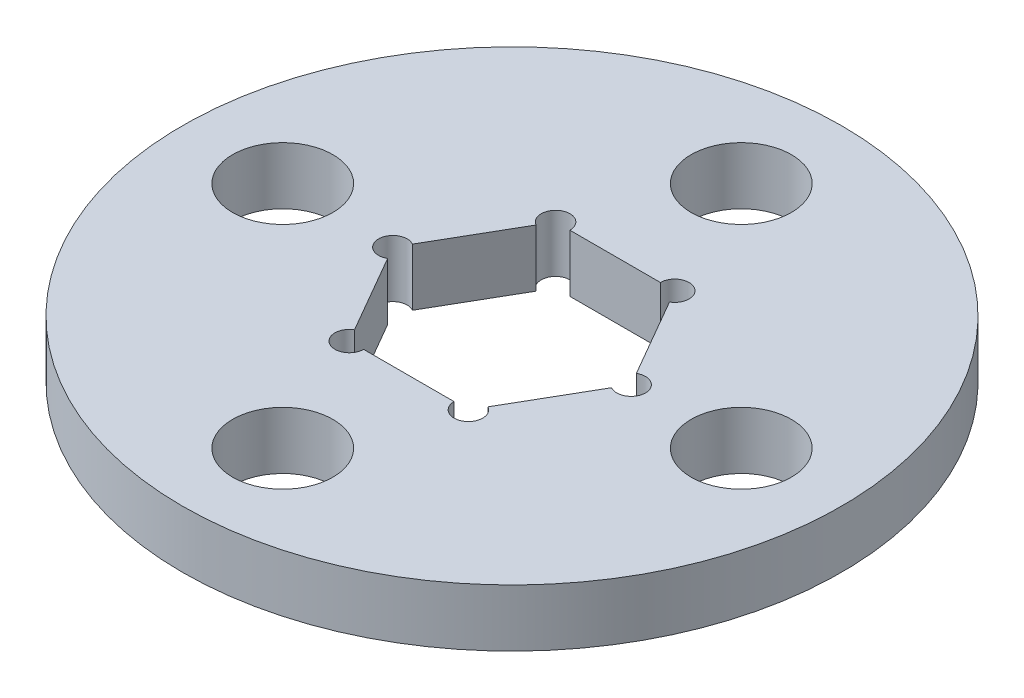
ISO-10303-21;
HEADER;
FILE_DESCRIPTION(('STEP AP214'),'2;1');
FILE_NAME('part.step','',(''),(''),'','','');
FILE_SCHEMA(('AUTOMOTIVE_DESIGN { 1 0 10303 214 1 1 1 1 }'));
ENDSEC;
DATA;
#1=APPLICATION_CONTEXT('core data for automotive mechanical design processes');
#2=APPLICATION_PROTOCOL_DEFINITION('international standard','automotive_design',2000,#1);
#3=PRODUCT_CONTEXT('',#1,'mechanical');
#4=PRODUCT('Part','Part','',(#3));
#5=PRODUCT_RELATED_PRODUCT_CATEGORY('part','',(#4));
#6=PRODUCT_DEFINITION_FORMATION('','',#4);
#7=PRODUCT_DEFINITION_CONTEXT('part definition',#1,'design');
#8=PRODUCT_DEFINITION('design','',#6,#7);
#9=PRODUCT_DEFINITION_SHAPE('','',#8);
#10=(LENGTH_UNIT() NAMED_UNIT(*) SI_UNIT(.MILLI.,.METRE.));
#11=(NAMED_UNIT(*) PLANE_ANGLE_UNIT() SI_UNIT($,.RADIAN.));
#12=(NAMED_UNIT(*) SI_UNIT($,.STERADIAN.) SOLID_ANGLE_UNIT());
#13=UNCERTAINTY_MEASURE_WITH_UNIT(LENGTH_MEASURE(1.E-05),#10,'distance_accuracy_value','');
#14=(GEOMETRIC_REPRESENTATION_CONTEXT(3) GLOBAL_UNCERTAINTY_ASSIGNED_CONTEXT((#13)) GLOBAL_UNIT_ASSIGNED_CONTEXT((#10,
#11,#12)) REPRESENTATION_CONTEXT('',''));
#15=CARTESIAN_POINT('',(0.,0.,0.));
#16=DIRECTION('',(0.,0.,1.));
#17=DIRECTION('',(1.,0.,0.));
#18=AXIS2_PLACEMENT_3D('',#15,#16,#17);
#19=CARTESIAN_POINT('',(0.,2.,0.));
#20=DIRECTION('',(0.,1.,0.));
#21=DIRECTION('',(0.,0.,1.));
#22=AXIS2_PLACEMENT_3D('',#19,#20,#21);
#23=PLANE('',#22);
#24=CARTESIAN_POINT('',(-4.15692193816526,2.,0.));
#25=DIRECTION('',(0.,-1.,0.));
#26=DIRECTION('',(0.,0.,-1.));
#27=AXIS2_PLACEMENT_3D('',#24,#25,#26);
#28=CIRCLE('',#27,0.5);
#29=CARTESIAN_POINT('',(-3.90692193816526,2.,0.433012701892296));
#30=VERTEX_POINT('',#29);
#31=CARTESIAN_POINT('',(-3.90692193816532,2.,-0.433012701892182));
#32=VERTEX_POINT('',#31);
#33=EDGE_CURVE('E345',#30,#32,#28,.T.);
#34=ORIENTED_EDGE('',*,*,#33,.T.);
#35=DIRECTION('',(-0.499999999999999,0.,0.866025403784439));
#36=VECTOR('',#35,1.);
#37=CARTESIAN_POINT('',(-2.07846096908265,2.,-3.6));
#38=LINE('',#37,#36);
#39=CARTESIAN_POINT('',(-2.32846096908267,2.,-3.16698729810775));
#40=VERTEX_POINT('',#39);
#41=EDGE_CURVE('E181',#40,#32,#38,.T.);
#42=ORIENTED_EDGE('',*,*,#41,.F.);
#43=CARTESIAN_POINT('',(-2.07846096908269,2.,-3.59999999999998));
#44=DIRECTION('',(0.,-1.,0.));
#45=DIRECTION('',(0.,0.,-1.));
#46=AXIS2_PLACEMENT_3D('',#43,#44,#45);
#47=CIRCLE('',#46,0.5);
#48=CARTESIAN_POINT('',(-1.57846096908269,2.,-3.6));
#49=VERTEX_POINT('',#48);
#50=EDGE_CURVE('E74',#40,#49,#47,.T.);
#51=ORIENTED_EDGE('',*,*,#50,.T.);
#52=DIRECTION('',(-1.,0.,0.));
#53=VECTOR('',#52,1.);
#54=CARTESIAN_POINT('',(2.07846096908265,2.,-3.6));
#55=LINE('',#54,#53);
#56=CARTESIAN_POINT('',(1.57846096908263,2.,-3.6));
#57=VERTEX_POINT('',#56);
#58=EDGE_CURVE('E300',#57,#49,#55,.T.);
#59=ORIENTED_EDGE('',*,*,#58,.F.);
#60=CARTESIAN_POINT('',(2.07846096908263,2.,-3.60000000000002));
#61=DIRECTION('',(0.,-1.,0.));
#62=DIRECTION('',(0.,0.,-1.));
#63=AXIS2_PLACEMENT_3D('',#60,#61,#62);
#64=CIRCLE('',#63,0.5);
#65=CARTESIAN_POINT('',(2.32846096908264,2.,-3.1669872981078));
#66=VERTEX_POINT('',#65);
#67=EDGE_CURVE('E66',#57,#66,#64,.T.);
#68=ORIENTED_EDGE('',*,*,#67,.T.);
#69=DIRECTION('',(-0.5,0.,-0.866025403784439));
#70=VECTOR('',#69,1.);
#71=CARTESIAN_POINT('',(4.15692193816531,2.,0.));
#72=LINE('',#71,#70);
#73=CARTESIAN_POINT('',(3.9069219381653,2.,-0.433012701892235));
#74=VERTEX_POINT('',#73);
#75=EDGE_CURVE('E209',#74,#66,#72,.T.);
#76=ORIENTED_EDGE('',*,*,#75,.F.);
#77=CARTESIAN_POINT('',(4.15692193816531,2.,0.));
#78=DIRECTION('',(0.,-1.,0.));
#79=DIRECTION('',(0.,0.,-1.));
#80=AXIS2_PLACEMENT_3D('',#77,#78,#79);
#81=CIRCLE('',#80,0.5);
#82=CARTESIAN_POINT('',(3.90692193816532,2.,0.433012701892201));
#83=VERTEX_POINT('',#82);
#84=EDGE_CURVE('E165',#74,#83,#81,.T.);
#85=ORIENTED_EDGE('',*,*,#84,.T.);
#86=DIRECTION('',(0.5,0.,-0.866025403784439));
#87=VECTOR('',#86,1.);
#88=CARTESIAN_POINT('',(2.07846096908265,2.,3.6));
#89=LINE('',#88,#87);
#90=CARTESIAN_POINT('',(2.32846096908266,2.,3.16698729810777));
#91=VERTEX_POINT('',#90);
#92=EDGE_CURVE('E162',#91,#83,#89,.T.);
#93=ORIENTED_EDGE('',*,*,#92,.F.);
#94=CARTESIAN_POINT('',(2.07846096908266,2.,3.59999999999999));
#95=DIRECTION('',(0.,-1.,0.));
#96=DIRECTION('',(0.,0.,-1.));
#97=AXIS2_PLACEMENT_3D('',#94,#95,#96);
#98=CIRCLE('',#97,0.5);
#99=CARTESIAN_POINT('',(1.57846096908266,2.,3.6));
#100=VERTEX_POINT('',#99);
#101=EDGE_CURVE('E142',#91,#100,#98,.T.);
#102=ORIENTED_EDGE('',*,*,#101,.T.);
#103=DIRECTION('',(1.,0.,0.));
#104=VECTOR('',#103,1.);
#105=CARTESIAN_POINT('',(-2.07846096908265,2.,3.6));
#106=LINE('',#105,#104);
#107=CARTESIAN_POINT('',(-1.57846096908265,2.,3.6));
#108=VERTEX_POINT('',#107);
#109=EDGE_CURVE('E159',#108,#100,#106,.T.);
#110=ORIENTED_EDGE('',*,*,#109,.F.);
#111=CARTESIAN_POINT('',(-2.07846096908265,2.,3.6));
#112=DIRECTION('',(0.,-1.,0.));
#113=DIRECTION('',(0.,0.,-1.));
#114=AXIS2_PLACEMENT_3D('',#111,#112,#113);
#115=CIRCLE('',#114,0.5);
#116=CARTESIAN_POINT('',(-2.32846096908265,2.,3.16698729810778));
#117=VERTEX_POINT('',#116);
#118=EDGE_CURVE('E164',#108,#117,#115,.T.);
#119=ORIENTED_EDGE('',*,*,#118,.T.);
#120=DIRECTION('',(0.5,0.,0.866025403784439));
#121=VECTOR('',#120,1.);
#122=CARTESIAN_POINT('',(-4.1569219381653,2.,0.));
#123=LINE('',#122,#121);
#124=EDGE_CURVE('E171',#30,#117,#123,.T.);
#125=ORIENTED_EDGE('',*,*,#124,.F.);
#126=EDGE_LOOP('',(#34,#42,#51,#59,#68,#76,#85,#93,#102,#110,#119,#125));
#127=FACE_BOUND('',#126,.T.);
#128=CARTESIAN_POINT('',(0.,2.,8.));
#129=DIRECTION('',(0.,1.,0.));
#130=DIRECTION('',(0.,0.,1.));
#131=AXIS2_PLACEMENT_3D('',#128,#129,#130);
#132=CIRCLE('',#131,1.75);
#133=CARTESIAN_POINT('',(0.,2.,9.75));
#134=VERTEX_POINT('',#133);
#135=EDGE_CURVE('E276',#134,#134,#132,.T.);
#136=ORIENTED_EDGE('',*,*,#135,.F.);
#137=EDGE_LOOP('',(#136));
#138=FACE_BOUND('',#137,.T.);
#139=CARTESIAN_POINT('',(0.,2.,-8.));
#140=DIRECTION('',(0.,1.,0.));
#141=DIRECTION('',(0.,0.,1.));
#142=AXIS2_PLACEMENT_3D('',#139,#140,#141);
#143=CIRCLE('',#142,1.75);
#144=CARTESIAN_POINT('',(0.,2.,-6.25));
#145=VERTEX_POINT('',#144);
#146=EDGE_CURVE('E190',#145,#145,#143,.T.);
#147=ORIENTED_EDGE('',*,*,#146,.F.);
#148=EDGE_LOOP('',(#147));
#149=FACE_BOUND('',#148,.T.);
#150=CARTESIAN_POINT('',(0.,2.,0.));
#151=DIRECTION('',(0.,1.,0.));
#152=DIRECTION('',(0.,0.,1.));
#153=AXIS2_PLACEMENT_3D('',#150,#151,#152);
#154=CIRCLE('',#153,11.5);
#155=CARTESIAN_POINT('',(0.,2.,11.5));
#156=VERTEX_POINT('',#155);
#157=EDGE_CURVE('E210',#156,#156,#154,.T.);
#158=ORIENTED_EDGE('',*,*,#157,.T.);
#159=EDGE_LOOP('',(#158));
#160=FACE_BOUND('',#159,.T.);
#161=CARTESIAN_POINT('',(8.,2.,0.));
#162=DIRECTION('',(0.,1.,0.));
#163=DIRECTION('',(0.,0.,1.));
#164=AXIS2_PLACEMENT_3D('',#161,#162,#163);
#165=CIRCLE('',#164,1.75);
#166=CARTESIAN_POINT('',(8.,2.,1.75));
#167=VERTEX_POINT('',#166);
#168=EDGE_CURVE('E283',#167,#167,#165,.T.);
#169=ORIENTED_EDGE('',*,*,#168,.F.);
#170=EDGE_LOOP('',(#169));
#171=FACE_BOUND('',#170,.T.);
#172=CARTESIAN_POINT('',(-8.,2.,0.));
#173=DIRECTION('',(0.,1.,0.));
#174=DIRECTION('',(0.,0.,1.));
#175=AXIS2_PLACEMENT_3D('',#172,#173,#174);
#176=CIRCLE('',#175,1.75);
#177=CARTESIAN_POINT('',(-8.,2.,1.75));
#178=VERTEX_POINT('',#177);
#179=EDGE_CURVE('E268',#178,#178,#176,.T.);
#180=ORIENTED_EDGE('',*,*,#179,.F.);
#181=EDGE_LOOP('',(#180));
#182=FACE_BOUND('',#181,.T.);
#183=ADVANCED_FACE('F51',(#127,#138,#149,#160,#171,#182),#23,.T.);
#184=CARTESIAN_POINT('',(0.,0.,0.));
#185=DIRECTION('',(0.,1.,0.));
#186=DIRECTION('',(0.,0.,1.));
#187=AXIS2_PLACEMENT_3D('',#184,#185,#186);
#188=PLANE('',#187);
#189=CARTESIAN_POINT('',(0.,0.,0.));
#190=DIRECTION('',(0.,1.,0.));
#191=DIRECTION('',(0.,0.,1.));
#192=AXIS2_PLACEMENT_3D('',#189,#190,#191);
#193=CIRCLE('',#192,11.5);
#194=CARTESIAN_POINT('',(0.,0.,11.5));
#195=VERTEX_POINT('',#194);
#196=EDGE_CURVE('E177',#195,#195,#193,.T.);
#197=ORIENTED_EDGE('',*,*,#196,.F.);
#198=EDGE_LOOP('',(#197));
#199=FACE_BOUND('',#198,.T.);
#200=DIRECTION('',(-0.499999999999999,0.,0.866025403784439));
#201=VECTOR('',#200,1.);
#202=CARTESIAN_POINT('',(-2.07846096908265,0.,-3.6));
#203=LINE('',#202,#201);
#204=CARTESIAN_POINT('',(-2.32846096908267,0.,-3.16698729810775));
#205=VERTEX_POINT('',#204);
#206=CARTESIAN_POINT('',(-3.90692193816532,0.,-0.433012701892182));
#207=VERTEX_POINT('',#206);
#208=EDGE_CURVE('E194',#205,#207,#203,.T.);
#209=ORIENTED_EDGE('',*,*,#208,.T.);
#210=CARTESIAN_POINT('',(-4.15692193816526,0.,0.));
#211=DIRECTION('',(0.,1.,0.));
#212=DIRECTION('',(0.,0.,1.));
#213=AXIS2_PLACEMENT_3D('',#210,#211,#212);
#214=CIRCLE('',#213,0.5);
#215=CARTESIAN_POINT('',(-3.90692193816526,0.,0.433012701892295));
#216=VERTEX_POINT('',#215);
#217=EDGE_CURVE('E251',#207,#216,#214,.T.);
#218=ORIENTED_EDGE('',*,*,#217,.T.);
#219=DIRECTION('',(0.5,0.,0.866025403784439));
#220=VECTOR('',#219,1.);
#221=CARTESIAN_POINT('',(-4.1569219381653,0.,0.));
#222=LINE('',#221,#220);
#223=CARTESIAN_POINT('',(-2.32846096908265,0.,3.16698729810778));
#224=VERTEX_POINT('',#223);
#225=EDGE_CURVE('E198',#216,#224,#222,.T.);
#226=ORIENTED_EDGE('',*,*,#225,.T.);
#227=CARTESIAN_POINT('',(-2.07846096908265,0.,3.6));
#228=DIRECTION('',(0.,1.,0.));
#229=DIRECTION('',(0.,0.,1.));
#230=AXIS2_PLACEMENT_3D('',#227,#228,#229);
#231=CIRCLE('',#230,0.5);
#232=CARTESIAN_POINT('',(-1.57846096908265,0.,3.6));
#233=VERTEX_POINT('',#232);
#234=EDGE_CURVE('E315',#224,#233,#231,.T.);
#235=ORIENTED_EDGE('',*,*,#234,.T.);
#236=DIRECTION('',(1.,0.,0.));
#237=VECTOR('',#236,1.);
#238=CARTESIAN_POINT('',(-2.07846096908265,0.,3.6));
#239=LINE('',#238,#237);
#240=CARTESIAN_POINT('',(1.57846096908266,0.,3.6));
#241=VERTEX_POINT('',#240);
#242=EDGE_CURVE('E202',#233,#241,#239,.T.);
#243=ORIENTED_EDGE('',*,*,#242,.T.);
#244=CARTESIAN_POINT('',(2.07846096908266,0.,3.59999999999999));
#245=DIRECTION('',(0.,1.,0.));
#246=DIRECTION('',(0.,0.,1.));
#247=AXIS2_PLACEMENT_3D('',#244,#245,#246);
#248=CIRCLE('',#247,0.5);
#249=CARTESIAN_POINT('',(2.32846096908266,0.,3.16698729810777));
#250=VERTEX_POINT('',#249);
#251=EDGE_CURVE('E145',#241,#250,#248,.T.);
#252=ORIENTED_EDGE('',*,*,#251,.T.);
#253=DIRECTION('',(0.5,0.,-0.866025403784439));
#254=VECTOR('',#253,1.);
#255=CARTESIAN_POINT('',(2.07846096908265,0.,3.6));
#256=LINE('',#255,#254);
#257=CARTESIAN_POINT('',(3.90692193816532,0.,0.433012701892201));
#258=VERTEX_POINT('',#257);
#259=EDGE_CURVE('E205',#250,#258,#256,.T.);
#260=ORIENTED_EDGE('',*,*,#259,.T.);
#261=CARTESIAN_POINT('',(4.15692193816531,0.,0.));
#262=DIRECTION('',(0.,1.,0.));
#263=DIRECTION('',(0.,0.,1.));
#264=AXIS2_PLACEMENT_3D('',#261,#262,#263);
#265=CIRCLE('',#264,0.5);
#266=CARTESIAN_POINT('',(3.9069219381653,0.,-0.433012701892235));
#267=VERTEX_POINT('',#266);
#268=EDGE_CURVE('E151',#258,#267,#265,.T.);
#269=ORIENTED_EDGE('',*,*,#268,.T.);
#270=DIRECTION('',(-0.5,0.,-0.866025403784439));
#271=VECTOR('',#270,1.);
#272=CARTESIAN_POINT('',(4.15692193816531,0.,0.));
#273=LINE('',#272,#271);
#274=CARTESIAN_POINT('',(2.32846096908264,0.,-3.1669872981078));
#275=VERTEX_POINT('',#274);
#276=EDGE_CURVE('E185',#267,#275,#273,.T.);
#277=ORIENTED_EDGE('',*,*,#276,.T.);
#278=CARTESIAN_POINT('',(2.07846096908263,0.,-3.60000000000002));
#279=DIRECTION('',(0.,1.,0.));
#280=DIRECTION('',(0.,0.,1.));
#281=AXIS2_PLACEMENT_3D('',#278,#279,#280);
#282=CIRCLE('',#281,0.5);
#283=CARTESIAN_POINT('',(1.57846096908263,0.,-3.6));
#284=VERTEX_POINT('',#283);
#285=EDGE_CURVE('E261',#275,#284,#282,.T.);
#286=ORIENTED_EDGE('',*,*,#285,.T.);
#287=DIRECTION('',(-1.,0.,0.));
#288=VECTOR('',#287,1.);
#289=CARTESIAN_POINT('',(2.07846096908265,0.,-3.6));
#290=LINE('',#289,#288);
#291=CARTESIAN_POINT('',(-1.57846096908269,0.,-3.6));
#292=VERTEX_POINT('',#291);
#293=EDGE_CURVE('E189',#284,#292,#290,.T.);
#294=ORIENTED_EDGE('',*,*,#293,.T.);
#295=CARTESIAN_POINT('',(-2.07846096908269,0.,-3.59999999999998));
#296=DIRECTION('',(0.,1.,0.));
#297=DIRECTION('',(0.,0.,1.));
#298=AXIS2_PLACEMENT_3D('',#295,#296,#297);
#299=CIRCLE('',#298,0.5);
#300=EDGE_CURVE('E231',#292,#205,#299,.T.);
#301=ORIENTED_EDGE('',*,*,#300,.T.);
#302=EDGE_LOOP('',(#209,#218,#226,#235,#243,#252,#260,#269,#277,#286,#294,#301));
#303=FACE_BOUND('',#302,.T.);
#304=CARTESIAN_POINT('',(0.,0.,-8.));
#305=DIRECTION('',(0.,1.,0.));
#306=DIRECTION('',(0.,0.,1.));
#307=AXIS2_PLACEMENT_3D('',#304,#305,#306);
#308=CIRCLE('',#307,1.75);
#309=CARTESIAN_POINT('',(0.,0.,-6.25));
#310=VERTEX_POINT('',#309);
#311=EDGE_CURVE('E287',#310,#310,#308,.T.);
#312=ORIENTED_EDGE('',*,*,#311,.T.);
#313=EDGE_LOOP('',(#312));
#314=FACE_BOUND('',#313,.T.);
#315=CARTESIAN_POINT('',(8.,0.,0.));
#316=DIRECTION('',(0.,1.,0.));
#317=DIRECTION('',(0.,0.,1.));
#318=AXIS2_PLACEMENT_3D('',#315,#316,#317);
#319=CIRCLE('',#318,1.75);
#320=CARTESIAN_POINT('',(8.,0.,1.75));
#321=VERTEX_POINT('',#320);
#322=EDGE_CURVE('E280',#321,#321,#319,.T.);
#323=ORIENTED_EDGE('',*,*,#322,.T.);
#324=EDGE_LOOP('',(#323));
#325=FACE_BOUND('',#324,.T.);
#326=CARTESIAN_POINT('',(0.,0.,8.));
#327=DIRECTION('',(0.,1.,0.));
#328=DIRECTION('',(0.,0.,1.));
#329=AXIS2_PLACEMENT_3D('',#326,#327,#328);
#330=CIRCLE('',#329,1.75);
#331=CARTESIAN_POINT('',(0.,0.,9.75));
#332=VERTEX_POINT('',#331);
#333=EDGE_CURVE('E272',#332,#332,#330,.T.);
#334=ORIENTED_EDGE('',*,*,#333,.T.);
#335=EDGE_LOOP('',(#334));
#336=FACE_BOUND('',#335,.T.);
#337=CARTESIAN_POINT('',(-8.,0.,0.));
#338=DIRECTION('',(0.,1.,0.));
#339=DIRECTION('',(0.,0.,1.));
#340=AXIS2_PLACEMENT_3D('',#337,#338,#339);
#341=CIRCLE('',#340,1.75);
#342=CARTESIAN_POINT('',(-8.,0.,1.75));
#343=VERTEX_POINT('',#342);
#344=EDGE_CURVE('E267',#343,#343,#341,.T.);
#345=ORIENTED_EDGE('',*,*,#344,.T.);
#346=EDGE_LOOP('',(#345));
#347=FACE_BOUND('',#346,.T.);
#348=ADVANCED_FACE('F238',(#199,#303,#314,#325,#336,#347),#188,.F.);
#349=CARTESIAN_POINT('',(0.,2.,0.));
#350=DIRECTION('',(0.,-1.,0.));
#351=DIRECTION('',(0.,0.,-1.));
#352=AXIS2_PLACEMENT_3D('',#349,#350,#351);
#353=CYLINDRICAL_SURFACE('',#352,11.5);
#354=ORIENTED_EDGE('',*,*,#157,.F.);
#355=EDGE_LOOP('',(#354));
#356=FACE_BOUND('',#355,.T.);
#357=ORIENTED_EDGE('',*,*,#196,.T.);
#358=EDGE_LOOP('',(#357));
#359=FACE_BOUND('',#358,.T.);
#360=ADVANCED_FACE('F53',(#356,#359),#353,.T.);
#361=CARTESIAN_POINT('',(4.15692193816531,2.,0.));
#362=DIRECTION('',(-0.866025403784439,0.,0.5));
#363=DIRECTION('',(0.5,0.,0.866025403784439));
#364=AXIS2_PLACEMENT_3D('',#361,#362,#363);
#365=PLANE('',#364);
#366=DIRECTION('',(0.,-1.,0.));
#367=VECTOR('',#366,1.);
#368=CARTESIAN_POINT('',(2.32846096908264,2.,-3.1669872981078));
#369=LINE('',#368,#367);
#370=EDGE_CURVE('E264',#275,#66,#369,.F.);
#371=ORIENTED_EDGE('',*,*,#370,.F.);
#372=ORIENTED_EDGE('',*,*,#276,.F.);
#373=DIRECTION('',(0.,-1.,0.));
#374=VECTOR('',#373,1.);
#375=CARTESIAN_POINT('',(3.9069219381653,2.,-0.433012701892235));
#376=LINE('',#375,#374);
#377=EDGE_CURVE('E355',#74,#267,#376,.T.);
#378=ORIENTED_EDGE('',*,*,#377,.F.);
#379=ORIENTED_EDGE('',*,*,#75,.T.);
#380=EDGE_LOOP('',(#371,#372,#378,#379));
#381=FACE_BOUND('',#380,.T.);
#382=ADVANCED_FACE('F378',(#381),#365,.T.);
#383=CARTESIAN_POINT('',(2.07846096908265,2.,-3.6));
#384=DIRECTION('',(0.,0.,1.));
#385=DIRECTION('',(1.,0.,0.));
#386=AXIS2_PLACEMENT_3D('',#383,#384,#385);
#387=PLANE('',#386);
#388=DIRECTION('',(0.,-1.,0.));
#389=VECTOR('',#388,1.);
#390=CARTESIAN_POINT('',(-1.57846096908269,2.,-3.6));
#391=LINE('',#390,#389);
#392=EDGE_CURVE('E244',#292,#49,#391,.F.);
#393=ORIENTED_EDGE('',*,*,#392,.F.);
#394=ORIENTED_EDGE('',*,*,#293,.F.);
#395=DIRECTION('',(0.,-1.,0.));
#396=VECTOR('',#395,1.);
#397=CARTESIAN_POINT('',(1.57846096908263,2.,-3.6));
#398=LINE('',#397,#396);
#399=EDGE_CURVE('E11',#57,#284,#398,.T.);
#400=ORIENTED_EDGE('',*,*,#399,.F.);
#401=ORIENTED_EDGE('',*,*,#58,.T.);
#402=EDGE_LOOP('',(#393,#394,#400,#401));
#403=FACE_BOUND('',#402,.T.);
#404=ADVANCED_FACE('F382',(#403),#387,.T.);
#405=CARTESIAN_POINT('',(-2.07846096908265,2.,-3.6));
#406=DIRECTION('',(0.866025403784439,0.,0.499999999999999));
#407=DIRECTION('',(0.499999999999999,0.,-0.866025403784439));
#408=AXIS2_PLACEMENT_3D('',#405,#406,#407);
#409=PLANE('',#408);
#410=DIRECTION('',(0.,-1.,0.));
#411=VECTOR('',#410,1.);
#412=CARTESIAN_POINT('',(-3.90692193816532,2.,-0.433012701892182));
#413=LINE('',#412,#411);
#414=EDGE_CURVE('E245',#207,#32,#413,.F.);
#415=ORIENTED_EDGE('',*,*,#414,.F.);
#416=ORIENTED_EDGE('',*,*,#208,.F.);
#417=DIRECTION('',(0.,-1.,0.));
#418=VECTOR('',#417,1.);
#419=CARTESIAN_POINT('',(-2.32846096908267,2.,-3.16698729810775));
#420=LINE('',#419,#418);
#421=EDGE_CURVE('E60',#40,#205,#420,.T.);
#422=ORIENTED_EDGE('',*,*,#421,.F.);
#423=ORIENTED_EDGE('',*,*,#41,.T.);
#424=EDGE_LOOP('',(#415,#416,#422,#423));
#425=FACE_BOUND('',#424,.T.);
#426=ADVANCED_FACE('F248',(#425),#409,.T.);
#427=CARTESIAN_POINT('',(-4.1569219381653,2.,0.));
#428=DIRECTION('',(0.866025403784439,0.,-0.5));
#429=DIRECTION('',(-0.5,0.,-0.866025403784439));
#430=AXIS2_PLACEMENT_3D('',#427,#428,#429);
#431=PLANE('',#430);
#432=DIRECTION('',(0.,-1.,0.));
#433=VECTOR('',#432,1.);
#434=CARTESIAN_POINT('',(-3.90692193816526,2.,0.433012701892295));
#435=LINE('',#434,#433);
#436=EDGE_CURVE('E223',#30,#216,#435,.T.);
#437=ORIENTED_EDGE('',*,*,#436,.F.);
#438=ORIENTED_EDGE('',*,*,#124,.T.);
#439=DIRECTION('',(0.,-1.,0.));
#440=VECTOR('',#439,1.);
#441=CARTESIAN_POINT('',(-2.32846096908265,2.,3.16698729810778));
#442=LINE('',#441,#440);
#443=EDGE_CURVE('E255',#224,#117,#442,.F.);
#444=ORIENTED_EDGE('',*,*,#443,.F.);
#445=ORIENTED_EDGE('',*,*,#225,.F.);
#446=EDGE_LOOP('',(#437,#438,#444,#445));
#447=FACE_BOUND('',#446,.T.);
#448=ADVANCED_FACE('F388',(#447),#431,.T.);
#449=CARTESIAN_POINT('',(-2.07846096908265,2.,3.6));
#450=DIRECTION('',(0.,0.,-1.));
#451=DIRECTION('',(-1.,0.,0.));
#452=AXIS2_PLACEMENT_3D('',#449,#450,#451);
#453=PLANE('',#452);
#454=DIRECTION('',(0.,-1.,0.));
#455=VECTOR('',#454,1.);
#456=CARTESIAN_POINT('',(1.57846096908266,2.,3.6));
#457=LINE('',#456,#455);
#458=EDGE_CURVE('E139',#241,#100,#457,.F.);
#459=ORIENTED_EDGE('',*,*,#458,.F.);
#460=ORIENTED_EDGE('',*,*,#242,.F.);
#461=DIRECTION('',(0.,-1.,0.));
#462=VECTOR('',#461,1.);
#463=CARTESIAN_POINT('',(-1.57846096908265,2.,3.6));
#464=LINE('',#463,#462);
#465=EDGE_CURVE('E169',#108,#233,#464,.T.);
#466=ORIENTED_EDGE('',*,*,#465,.F.);
#467=ORIENTED_EDGE('',*,*,#109,.T.);
#468=EDGE_LOOP('',(#459,#460,#466,#467));
#469=FACE_BOUND('',#468,.T.);
#470=ADVANCED_FACE('F168',(#469),#453,.T.);
#471=CARTESIAN_POINT('',(2.07846096908265,2.,3.6));
#472=DIRECTION('',(-0.866025403784439,0.,-0.5));
#473=DIRECTION('',(-0.5,0.,0.866025403784439));
#474=AXIS2_PLACEMENT_3D('',#471,#472,#473);
#475=PLANE('',#474);
#476=DIRECTION('',(0.,-1.,0.));
#477=VECTOR('',#476,1.);
#478=CARTESIAN_POINT('',(3.90692193816532,2.,0.433012701892201));
#479=LINE('',#478,#477);
#480=EDGE_CURVE('E218',#258,#83,#479,.F.);
#481=ORIENTED_EDGE('',*,*,#480,.F.);
#482=ORIENTED_EDGE('',*,*,#259,.F.);
#483=DIRECTION('',(0.,-1.,0.));
#484=VECTOR('',#483,1.);
#485=CARTESIAN_POINT('',(2.32846096908266,2.,3.16698729810777));
#486=LINE('',#485,#484);
#487=EDGE_CURVE('E214',#91,#250,#486,.T.);
#488=ORIENTED_EDGE('',*,*,#487,.F.);
#489=ORIENTED_EDGE('',*,*,#92,.T.);
#490=EDGE_LOOP('',(#481,#482,#488,#489));
#491=FACE_BOUND('',#490,.T.);
#492=ADVANCED_FACE('F434',(#491),#475,.T.);
#493=CARTESIAN_POINT('',(0.,2.,-8.));
#494=DIRECTION('',(0.,-1.,0.));
#495=DIRECTION('',(0.,0.,-1.));
#496=AXIS2_PLACEMENT_3D('',#493,#494,#495);
#497=CYLINDRICAL_SURFACE('',#496,1.75);
#498=ORIENTED_EDGE('',*,*,#146,.T.);
#499=EDGE_LOOP('',(#498));
#500=FACE_BOUND('',#499,.T.);
#501=ORIENTED_EDGE('',*,*,#311,.F.);
#502=EDGE_LOOP('',(#501));
#503=FACE_BOUND('',#502,.T.);
#504=ADVANCED_FACE('F430',(#500,#503),#497,.F.);
#505=CARTESIAN_POINT('',(8.,2.,0.));
#506=DIRECTION('',(0.,-1.,0.));
#507=DIRECTION('',(0.,0.,-1.));
#508=AXIS2_PLACEMENT_3D('',#505,#506,#507);
#509=CYLINDRICAL_SURFACE('',#508,1.75);
#510=ORIENTED_EDGE('',*,*,#168,.T.);
#511=EDGE_LOOP('',(#510));
#512=FACE_BOUND('',#511,.T.);
#513=ORIENTED_EDGE('',*,*,#322,.F.);
#514=EDGE_LOOP('',(#513));
#515=FACE_BOUND('',#514,.T.);
#516=ADVANCED_FACE('F421',(#512,#515),#509,.F.);
#517=CARTESIAN_POINT('',(0.,2.,8.));
#518=DIRECTION('',(0.,-1.,0.));
#519=DIRECTION('',(0.,0.,-1.));
#520=AXIS2_PLACEMENT_3D('',#517,#518,#519);
#521=CYLINDRICAL_SURFACE('',#520,1.75);
#522=ORIENTED_EDGE('',*,*,#135,.T.);
#523=EDGE_LOOP('',(#522));
#524=FACE_BOUND('',#523,.T.);
#525=ORIENTED_EDGE('',*,*,#333,.F.);
#526=EDGE_LOOP('',(#525));
#527=FACE_BOUND('',#526,.T.);
#528=ADVANCED_FACE('F412',(#524,#527),#521,.F.);
#529=CARTESIAN_POINT('',(-8.,2.,0.));
#530=DIRECTION('',(0.,-1.,0.));
#531=DIRECTION('',(0.,0.,-1.));
#532=AXIS2_PLACEMENT_3D('',#529,#530,#531);
#533=CYLINDRICAL_SURFACE('',#532,1.75);
#534=ORIENTED_EDGE('',*,*,#179,.T.);
#535=EDGE_LOOP('',(#534));
#536=FACE_BOUND('',#535,.T.);
#537=ORIENTED_EDGE('',*,*,#344,.F.);
#538=EDGE_LOOP('',(#537));
#539=FACE_BOUND('',#538,.T.);
#540=ADVANCED_FACE('F409',(#536,#539),#533,.F.);
#541=CARTESIAN_POINT('',(2.07846096908266,2.,3.59999999999999));
#542=DIRECTION('',(0.,-1.,0.));
#543=DIRECTION('',(0.,0.,-1.));
#544=AXIS2_PLACEMENT_3D('',#541,#542,#543);
#545=CYLINDRICAL_SURFACE('',#544,0.5);
#546=ORIENTED_EDGE('',*,*,#458,.T.);
#547=ORIENTED_EDGE('',*,*,#101,.F.);
#548=ORIENTED_EDGE('',*,*,#487,.T.);
#549=ORIENTED_EDGE('',*,*,#251,.F.);
#550=EDGE_LOOP('',(#546,#547,#548,#549));
#551=FACE_BOUND('',#550,.T.);
#552=ADVANCED_FACE('F141',(#551),#545,.F.);
#553=CARTESIAN_POINT('',(4.15692193816531,2.,0.));
#554=DIRECTION('',(0.,-1.,0.));
#555=DIRECTION('',(0.,0.,-1.));
#556=AXIS2_PLACEMENT_3D('',#553,#554,#555);
#557=CYLINDRICAL_SURFACE('',#556,0.5);
#558=ORIENTED_EDGE('',*,*,#377,.T.);
#559=ORIENTED_EDGE('',*,*,#268,.F.);
#560=ORIENTED_EDGE('',*,*,#480,.T.);
#561=ORIENTED_EDGE('',*,*,#84,.F.);
#562=EDGE_LOOP('',(#558,#559,#560,#561));
#563=FACE_BOUND('',#562,.T.);
#564=ADVANCED_FACE('F419',(#563),#557,.F.);
#565=CARTESIAN_POINT('',(-2.07846096908265,2.,3.6));
#566=DIRECTION('',(0.,-1.,0.));
#567=DIRECTION('',(0.,0.,-1.));
#568=AXIS2_PLACEMENT_3D('',#565,#566,#567);
#569=CYLINDRICAL_SURFACE('',#568,0.5);
#570=ORIENTED_EDGE('',*,*,#443,.T.);
#571=ORIENTED_EDGE('',*,*,#118,.F.);
#572=ORIENTED_EDGE('',*,*,#465,.T.);
#573=ORIENTED_EDGE('',*,*,#234,.F.);
#574=EDGE_LOOP('',(#570,#571,#572,#573));
#575=FACE_BOUND('',#574,.T.);
#576=ADVANCED_FACE('F425',(#575),#569,.F.);
#577=CARTESIAN_POINT('',(-4.15692193816526,2.,0.));
#578=DIRECTION('',(0.,-1.,0.));
#579=DIRECTION('',(0.,0.,-1.));
#580=AXIS2_PLACEMENT_3D('',#577,#578,#579);
#581=CYLINDRICAL_SURFACE('',#580,0.5);
#582=ORIENTED_EDGE('',*,*,#414,.T.);
#583=ORIENTED_EDGE('',*,*,#33,.F.);
#584=ORIENTED_EDGE('',*,*,#436,.T.);
#585=ORIENTED_EDGE('',*,*,#217,.F.);
#586=EDGE_LOOP('',(#582,#583,#584,#585));
#587=FACE_BOUND('',#586,.T.);
#588=ADVANCED_FACE('F449',(#587),#581,.F.);
#589=CARTESIAN_POINT('',(-2.07846096908269,2.,-3.59999999999998));
#590=DIRECTION('',(0.,-1.,0.));
#591=DIRECTION('',(0.,0.,-1.));
#592=AXIS2_PLACEMENT_3D('',#589,#590,#591);
#593=CYLINDRICAL_SURFACE('',#592,0.5);
#594=ORIENTED_EDGE('',*,*,#392,.T.);
#595=ORIENTED_EDGE('',*,*,#50,.F.);
#596=ORIENTED_EDGE('',*,*,#421,.T.);
#597=ORIENTED_EDGE('',*,*,#300,.F.);
#598=EDGE_LOOP('',(#594,#595,#596,#597));
#599=FACE_BOUND('',#598,.T.);
#600=ADVANCED_FACE('F230',(#599),#593,.F.);
#601=CARTESIAN_POINT('',(2.07846096908263,2.,-3.60000000000002));
#602=DIRECTION('',(0.,-1.,0.));
#603=DIRECTION('',(0.,0.,-1.));
#604=AXIS2_PLACEMENT_3D('',#601,#602,#603);
#605=CYLINDRICAL_SURFACE('',#604,0.5);
#606=ORIENTED_EDGE('',*,*,#370,.T.);
#607=ORIENTED_EDGE('',*,*,#67,.F.);
#608=ORIENTED_EDGE('',*,*,#399,.T.);
#609=ORIENTED_EDGE('',*,*,#285,.F.);
#610=EDGE_LOOP('',(#606,#607,#608,#609));
#611=FACE_BOUND('',#610,.T.);
#612=ADVANCED_FACE('F380',(#611),#605,.F.);
#613=CLOSED_SHELL('',(#183,#348,#360,#382,#404,#426,#448,#470,#492,#504,#516,#528,#540,#552,
#564,#576,#588,#600,#612));
#614=MANIFOLD_SOLID_BREP('B2',#613);
#615=ADVANCED_BREP_SHAPE_REPRESENTATION('',(#18,#614),#14);
#616=SHAPE_DEFINITION_REPRESENTATION(#9,#615);
ENDSEC;
END-ISO-10303-21;
